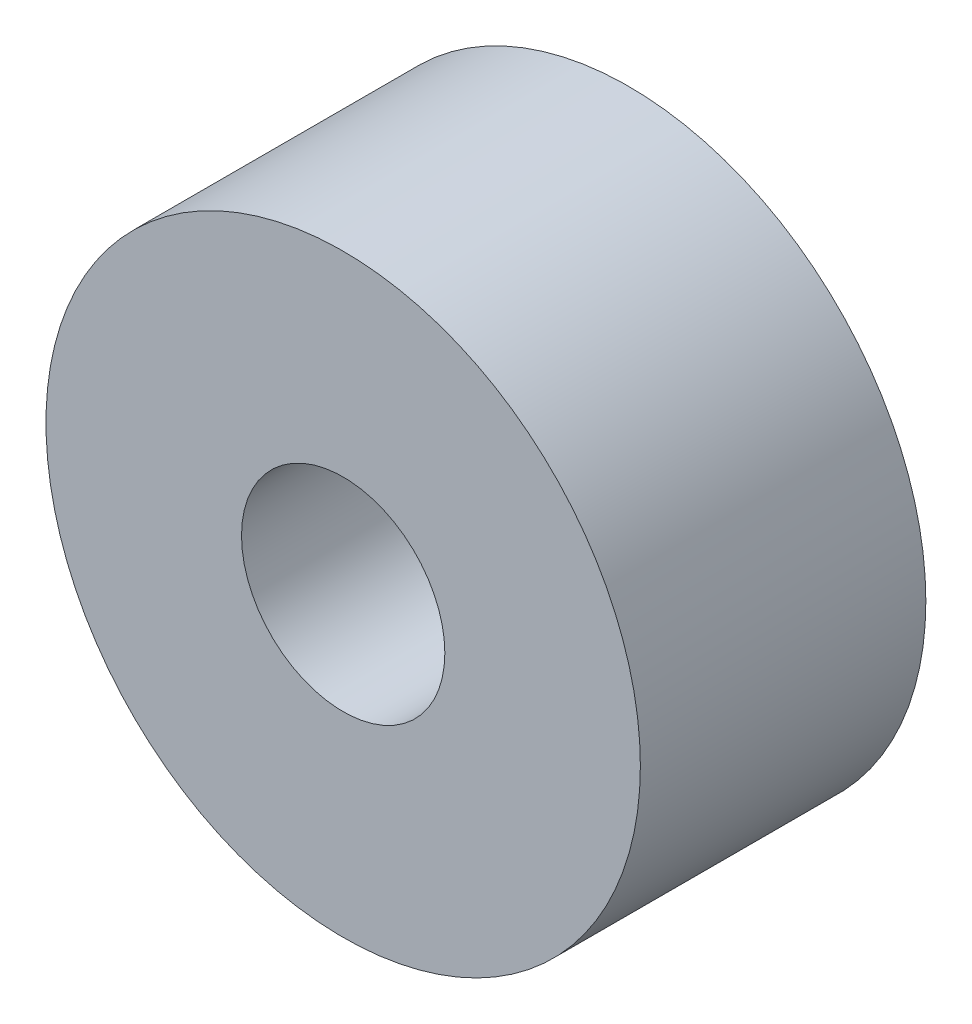
ISO-10303-21;
HEADER;
FILE_DESCRIPTION(('STEP AP214'),'2;1');
FILE_NAME('part.step','',(''),(''),'','','');
FILE_SCHEMA(('AUTOMOTIVE_DESIGN { 1 0 10303 214 1 1 1 1 }'));
ENDSEC;
DATA;
#1=APPLICATION_CONTEXT('core data for automotive mechanical design processes');
#2=APPLICATION_PROTOCOL_DEFINITION('international standard','automotive_design',2000,#1);
#3=PRODUCT_CONTEXT('',#1,'mechanical');
#4=PRODUCT('Part','Part','',(#3));
#5=PRODUCT_RELATED_PRODUCT_CATEGORY('part','',(#4));
#6=PRODUCT_DEFINITION_FORMATION('','',#4);
#7=PRODUCT_DEFINITION_CONTEXT('part definition',#1,'design');
#8=PRODUCT_DEFINITION('design','',#6,#7);
#9=PRODUCT_DEFINITION_SHAPE('','',#8);
#10=(LENGTH_UNIT() NAMED_UNIT(*) SI_UNIT(.MILLI.,.METRE.));
#11=(NAMED_UNIT(*) PLANE_ANGLE_UNIT() SI_UNIT($,.RADIAN.));
#12=(NAMED_UNIT(*) SI_UNIT($,.STERADIAN.) SOLID_ANGLE_UNIT());
#13=UNCERTAINTY_MEASURE_WITH_UNIT(LENGTH_MEASURE(1.E-05),#10,'distance_accuracy_value','');
#14=(GEOMETRIC_REPRESENTATION_CONTEXT(3) GLOBAL_UNCERTAINTY_ASSIGNED_CONTEXT((#13)) GLOBAL_UNIT_ASSIGNED_CONTEXT((#10,
#11,#12)) REPRESENTATION_CONTEXT('',''));
#15=CARTESIAN_POINT('',(0.,0.,0.));
#16=DIRECTION('',(0.,0.,1.));
#17=DIRECTION('',(1.,0.,0.));
#18=AXIS2_PLACEMENT_3D('',#15,#16,#17);
#19=CARTESIAN_POINT('',(0.,0.,9.271));
#20=DIRECTION('',(0.,0.,1.));
#21=DIRECTION('',(1.,0.,0.));
#22=AXIS2_PLACEMENT_3D('',#19,#20,#21);
#23=PLANE('',#22);
#24=CARTESIAN_POINT('',(0.,0.,9.271));
#25=DIRECTION('',(0.,0.,1.));
#26=DIRECTION('',(1.,0.,0.));
#27=AXIS2_PLACEMENT_3D('',#24,#25,#26);
#28=CIRCLE('',#27,9.652);
#29=CARTESIAN_POINT('',(9.652,0.,9.271));
#30=VERTEX_POINT('',#29);
#31=EDGE_CURVE('E10',#30,#30,#28,.T.);
#32=ORIENTED_EDGE('',*,*,#31,.T.);
#33=EDGE_LOOP('',(#32));
#34=FACE_BOUND('',#33,.T.);
#35=CARTESIAN_POINT('',(0.,0.,9.271));
#36=DIRECTION('',(0.,0.,1.));
#37=DIRECTION('',(1.,0.,0.));
#38=AXIS2_PLACEMENT_3D('',#35,#36,#37);
#39=CIRCLE('',#38,3.302);
#40=CARTESIAN_POINT('',(3.302,0.,9.271));
#41=VERTEX_POINT('',#40);
#42=EDGE_CURVE('E44',#41,#41,#39,.T.);
#43=ORIENTED_EDGE('',*,*,#42,.F.);
#44=EDGE_LOOP('',(#43));
#45=FACE_BOUND('',#44,.T.);
#46=ADVANCED_FACE('F33',(#34,#45),#23,.T.);
#47=CARTESIAN_POINT('',(0.,0.,0.));
#48=DIRECTION('',(0.,0.,1.));
#49=DIRECTION('',(1.,0.,0.));
#50=AXIS2_PLACEMENT_3D('',#47,#48,#49);
#51=PLANE('',#50);
#52=CARTESIAN_POINT('',(0.,0.,0.));
#53=DIRECTION('',(0.,0.,1.));
#54=DIRECTION('',(1.,0.,0.));
#55=AXIS2_PLACEMENT_3D('',#52,#53,#54);
#56=CIRCLE('',#55,9.652);
#57=CARTESIAN_POINT('',(9.652,0.,0.));
#58=VERTEX_POINT('',#57);
#59=EDGE_CURVE('E37',#58,#58,#56,.T.);
#60=ORIENTED_EDGE('',*,*,#59,.F.);
#61=EDGE_LOOP('',(#60));
#62=FACE_BOUND('',#61,.T.);
#63=CARTESIAN_POINT('',(0.,0.,0.));
#64=DIRECTION('',(0.,0.,1.));
#65=DIRECTION('',(1.,0.,0.));
#66=AXIS2_PLACEMENT_3D('',#63,#64,#65);
#67=CIRCLE('',#66,3.302);
#68=CARTESIAN_POINT('',(3.302,0.,0.));
#69=VERTEX_POINT('',#68);
#70=EDGE_CURVE('E46',#69,#69,#67,.T.);
#71=ORIENTED_EDGE('',*,*,#70,.T.);
#72=EDGE_LOOP('',(#71));
#73=FACE_BOUND('',#72,.T.);
#74=ADVANCED_FACE('F56',(#62,#73),#51,.F.);
#75=CARTESIAN_POINT('',(0.,0.,9.271));
#76=DIRECTION('',(0.,0.,-1.));
#77=DIRECTION('',(-1.,0.,0.));
#78=AXIS2_PLACEMENT_3D('',#75,#76,#77);
#79=CYLINDRICAL_SURFACE('',#78,9.652);
#80=ORIENTED_EDGE('',*,*,#31,.F.);
#81=EDGE_LOOP('',(#80));
#82=FACE_BOUND('',#81,.T.);
#83=ORIENTED_EDGE('',*,*,#59,.T.);
#84=EDGE_LOOP('',(#83));
#85=FACE_BOUND('',#84,.T.);
#86=ADVANCED_FACE('F35',(#82,#85),#79,.T.);
#87=CARTESIAN_POINT('',(0.,0.,9.271));
#88=DIRECTION('',(0.,0.,-1.));
#89=DIRECTION('',(-1.,0.,0.));
#90=AXIS2_PLACEMENT_3D('',#87,#88,#89);
#91=CYLINDRICAL_SURFACE('',#90,3.302);
#92=ORIENTED_EDGE('',*,*,#42,.T.);
#93=EDGE_LOOP('',(#92));
#94=FACE_BOUND('',#93,.T.);
#95=ORIENTED_EDGE('',*,*,#70,.F.);
#96=EDGE_LOOP('',(#95));
#97=FACE_BOUND('',#96,.T.);
#98=ADVANCED_FACE('F52',(#94,#97),#91,.F.);
#99=CLOSED_SHELL('',(#46,#74,#86,#98));
#100=MANIFOLD_SOLID_BREP('B2',#99);
#101=ADVANCED_BREP_SHAPE_REPRESENTATION('',(#18,#100),#14);
#102=SHAPE_DEFINITION_REPRESENTATION(#9,#101);
ENDSEC;
END-ISO-10303-21;
